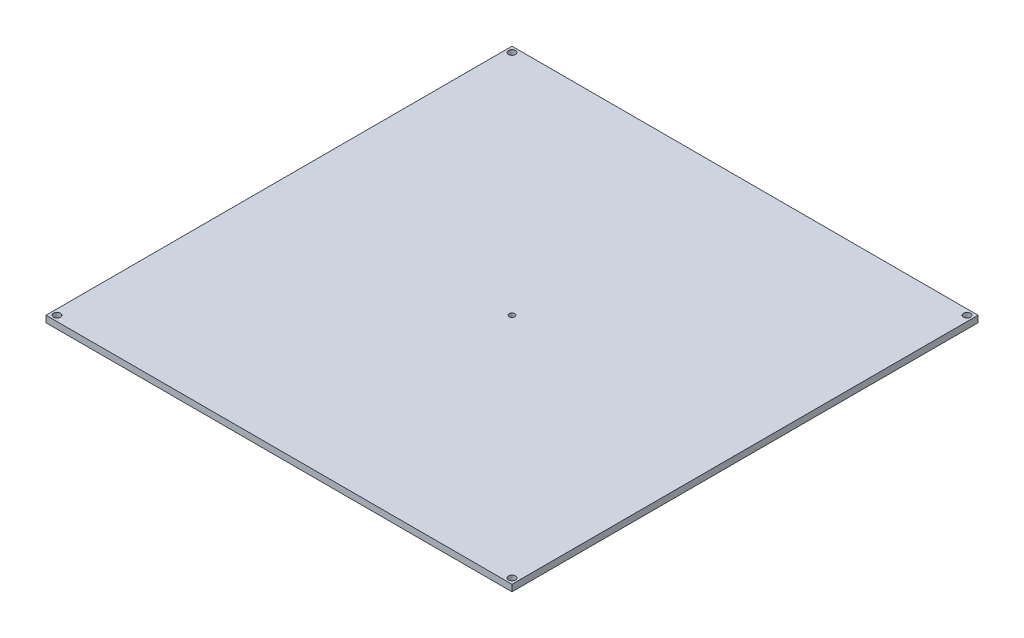
ISO-10303-21;
HEADER;
FILE_DESCRIPTION(('STEP AP214'),'2;1');
FILE_NAME('part.step','',(''),(''),'','','');
FILE_SCHEMA(('AUTOMOTIVE_DESIGN { 1 0 10303 214 1 1 1 1 }'));
ENDSEC;
DATA;
#1=APPLICATION_CONTEXT('core data for automotive mechanical design processes');
#2=APPLICATION_PROTOCOL_DEFINITION('international standard','automotive_design',2000,#1);
#3=PRODUCT_CONTEXT('',#1,'mechanical');
#4=PRODUCT('Part','Part','',(#3));
#5=PRODUCT_RELATED_PRODUCT_CATEGORY('part','',(#4));
#6=PRODUCT_DEFINITION_FORMATION('','',#4);
#7=PRODUCT_DEFINITION_CONTEXT('part definition',#1,'design');
#8=PRODUCT_DEFINITION('design','',#6,#7);
#9=PRODUCT_DEFINITION_SHAPE('','',#8);
#10=(LENGTH_UNIT() NAMED_UNIT(*) SI_UNIT(.MILLI.,.METRE.));
#11=(NAMED_UNIT(*) PLANE_ANGLE_UNIT() SI_UNIT($,.RADIAN.));
#12=(NAMED_UNIT(*) SI_UNIT($,.STERADIAN.) SOLID_ANGLE_UNIT());
#13=UNCERTAINTY_MEASURE_WITH_UNIT(LENGTH_MEASURE(1.E-05),#10,'distance_accuracy_value','');
#14=(GEOMETRIC_REPRESENTATION_CONTEXT(3) GLOBAL_UNCERTAINTY_ASSIGNED_CONTEXT((#13)) GLOBAL_UNIT_ASSIGNED_CONTEXT((#10,
#11,#12)) REPRESENTATION_CONTEXT('',''));
#15=CARTESIAN_POINT('',(0.,0.,0.));
#16=DIRECTION('',(0.,0.,1.));
#17=DIRECTION('',(1.,0.,0.));
#18=AXIS2_PLACEMENT_3D('',#15,#16,#17);
#19=CARTESIAN_POINT('',(106.75,-3.,106.75));
#20=DIRECTION('',(1.,0.,0.));
#21=DIRECTION('',(0.,0.,-1.));
#22=AXIS2_PLACEMENT_3D('',#19,#20,#21);
#23=PLANE('',#22);
#24=DIRECTION('',(0.,0.,-1.));
#25=VECTOR('',#24,1.);
#26=CARTESIAN_POINT('',(106.75,0.,106.75));
#27=LINE('',#26,#25);
#28=CARTESIAN_POINT('',(106.75,0.,106.75));
#29=VERTEX_POINT('',#28);
#30=CARTESIAN_POINT('',(106.75,0.,-106.75));
#31=VERTEX_POINT('',#30);
#32=EDGE_CURVE('E103',#29,#31,#27,.T.);
#33=ORIENTED_EDGE('',*,*,#32,.F.);
#34=DIRECTION('',(0.,1.,0.));
#35=VECTOR('',#34,1.);
#36=CARTESIAN_POINT('',(106.75,-3.,106.75));
#37=LINE('',#36,#35);
#38=CARTESIAN_POINT('',(106.75,-3.,106.75));
#39=VERTEX_POINT('',#38);
#40=EDGE_CURVE('E11',#39,#29,#37,.T.);
#41=ORIENTED_EDGE('',*,*,#40,.F.);
#42=DIRECTION('',(0.,0.,-1.));
#43=VECTOR('',#42,1.);
#44=CARTESIAN_POINT('',(106.75,-3.,106.75));
#45=LINE('',#44,#43);
#46=CARTESIAN_POINT('',(106.75,-3.,-106.75));
#47=VERTEX_POINT('',#46);
#48=EDGE_CURVE('E96',#39,#47,#45,.T.);
#49=ORIENTED_EDGE('',*,*,#48,.T.);
#50=DIRECTION('',(0.,1.,0.));
#51=VECTOR('',#50,1.);
#52=CARTESIAN_POINT('',(106.75,-3.,-106.75));
#53=LINE('',#52,#51);
#54=EDGE_CURVE('E41',#47,#31,#53,.T.);
#55=ORIENTED_EDGE('',*,*,#54,.T.);
#56=EDGE_LOOP('',(#33,#41,#49,#55));
#57=FACE_BOUND('',#56,.T.);
#58=ADVANCED_FACE('F38',(#57),#23,.T.);
#59=CARTESIAN_POINT('',(-106.75,-3.,106.75));
#60=DIRECTION('',(0.,0.,1.));
#61=DIRECTION('',(1.,0.,0.));
#62=AXIS2_PLACEMENT_3D('',#59,#60,#61);
#63=PLANE('',#62);
#64=DIRECTION('',(1.,0.,0.));
#65=VECTOR('',#64,1.);
#66=CARTESIAN_POINT('',(-106.75,0.,106.75));
#67=LINE('',#66,#65);
#68=CARTESIAN_POINT('',(-106.75,0.,106.75));
#69=VERTEX_POINT('',#68);
#70=EDGE_CURVE('E98',#69,#29,#67,.T.);
#71=ORIENTED_EDGE('',*,*,#70,.F.);
#72=DIRECTION('',(0.,1.,0.));
#73=VECTOR('',#72,1.);
#74=CARTESIAN_POINT('',(-106.75,-3.,106.75));
#75=LINE('',#74,#73);
#76=CARTESIAN_POINT('',(-106.75,-3.,106.75));
#77=VERTEX_POINT('',#76);
#78=EDGE_CURVE('E47',#77,#69,#75,.T.);
#79=ORIENTED_EDGE('',*,*,#78,.F.);
#80=DIRECTION('',(1.,0.,0.));
#81=VECTOR('',#80,1.);
#82=CARTESIAN_POINT('',(-106.75,-3.,106.75));
#83=LINE('',#82,#81);
#84=EDGE_CURVE('E93',#77,#39,#83,.T.);
#85=ORIENTED_EDGE('',*,*,#84,.T.);
#86=ORIENTED_EDGE('',*,*,#40,.T.);
#87=EDGE_LOOP('',(#71,#79,#85,#86));
#88=FACE_BOUND('',#87,.T.);
#89=ADVANCED_FACE('F114',(#88),#63,.T.);
#90=CARTESIAN_POINT('',(-106.75,-3.,106.75));
#91=DIRECTION('',(-1.,0.,0.));
#92=DIRECTION('',(0.,0.,1.));
#93=AXIS2_PLACEMENT_3D('',#90,#91,#92);
#94=PLANE('',#93);
#95=DIRECTION('',(0.,0.,1.));
#96=VECTOR('',#95,1.);
#97=CARTESIAN_POINT('',(-106.75,0.,106.75));
#98=LINE('',#97,#96);
#99=CARTESIAN_POINT('',(-106.75,0.,-106.75));
#100=VERTEX_POINT('',#99);
#101=EDGE_CURVE('E88',#100,#69,#98,.T.);
#102=ORIENTED_EDGE('',*,*,#101,.F.);
#103=DIRECTION('',(0.,1.,0.));
#104=VECTOR('',#103,1.);
#105=CARTESIAN_POINT('',(-106.75,-3.,-106.75));
#106=LINE('',#105,#104);
#107=CARTESIAN_POINT('',(-106.75,-3.,-106.75));
#108=VERTEX_POINT('',#107);
#109=EDGE_CURVE('E83',#108,#100,#106,.T.);
#110=ORIENTED_EDGE('',*,*,#109,.F.);
#111=DIRECTION('',(0.,0.,1.));
#112=VECTOR('',#111,1.);
#113=CARTESIAN_POINT('',(-106.75,-3.,106.75));
#114=LINE('',#113,#112);
#115=EDGE_CURVE('E86',#108,#77,#114,.T.);
#116=ORIENTED_EDGE('',*,*,#115,.T.);
#117=ORIENTED_EDGE('',*,*,#78,.T.);
#118=EDGE_LOOP('',(#102,#110,#116,#117));
#119=FACE_BOUND('',#118,.T.);
#120=ADVANCED_FACE('F85',(#119),#94,.T.);
#121=CARTESIAN_POINT('',(-106.75,-3.,-106.75));
#122=DIRECTION('',(0.,0.,-1.));
#123=DIRECTION('',(-1.,0.,0.));
#124=AXIS2_PLACEMENT_3D('',#121,#122,#123);
#125=PLANE('',#124);
#126=DIRECTION('',(-1.,0.,0.));
#127=VECTOR('',#126,1.);
#128=CARTESIAN_POINT('',(-106.75,0.,-106.75));
#129=LINE('',#128,#127);
#130=EDGE_CURVE('E106',#31,#100,#129,.T.);
#131=ORIENTED_EDGE('',*,*,#130,.F.);
#132=ORIENTED_EDGE('',*,*,#54,.F.);
#133=DIRECTION('',(-1.,0.,0.));
#134=VECTOR('',#133,1.);
#135=CARTESIAN_POINT('',(-106.75,-3.,-106.75));
#136=LINE('',#135,#134);
#137=EDGE_CURVE('E92',#47,#108,#136,.T.);
#138=ORIENTED_EDGE('',*,*,#137,.T.);
#139=ORIENTED_EDGE('',*,*,#109,.T.);
#140=EDGE_LOOP('',(#131,#132,#138,#139));
#141=FACE_BOUND('',#140,.T.);
#142=ADVANCED_FACE('F95',(#141),#125,.T.);
#143=CARTESIAN_POINT('',(0.,-3.,0.));
#144=DIRECTION('',(0.,-1.,0.));
#145=DIRECTION('',(0.,0.,-1.));
#146=AXIS2_PLACEMENT_3D('',#143,#144,#145);
#147=PLANE('',#146);
#148=CARTESIAN_POINT('',(0.,-3.,0.));
#149=DIRECTION('',(0.,1.,0.));
#150=DIRECTION('',(0.,0.,1.));
#151=AXIS2_PLACEMENT_3D('',#148,#149,#150);
#152=CIRCLE('',#151,1.25);
#153=CARTESIAN_POINT('',(0.,-3.,1.25));
#154=VERTEX_POINT('',#153);
#155=EDGE_CURVE('E159',#154,#154,#152,.T.);
#156=ORIENTED_EDGE('',*,*,#155,.T.);
#157=EDGE_LOOP('',(#156));
#158=FACE_BOUND('',#157,.T.);
#159=CARTESIAN_POINT('',(104.25,-3.,-104.25));
#160=DIRECTION('',(0.,1.,0.));
#161=DIRECTION('',(0.,0.,1.));
#162=AXIS2_PLACEMENT_3D('',#159,#160,#161);
#163=CIRCLE('',#162,1.6);
#164=CARTESIAN_POINT('',(104.25,-3.,-102.65));
#165=VERTEX_POINT('',#164);
#166=EDGE_CURVE('E169',#165,#165,#163,.T.);
#167=ORIENTED_EDGE('',*,*,#166,.T.);
#168=EDGE_LOOP('',(#167));
#169=FACE_BOUND('',#168,.T.);
#170=CARTESIAN_POINT('',(104.25,-3.,104.25));
#171=DIRECTION('',(0.,1.,0.));
#172=DIRECTION('',(0.,0.,1.));
#173=AXIS2_PLACEMENT_3D('',#170,#171,#172);
#174=CIRCLE('',#173,1.6);
#175=CARTESIAN_POINT('',(104.25,-3.,105.85));
#176=VERTEX_POINT('',#175);
#177=EDGE_CURVE('E175',#176,#176,#174,.T.);
#178=ORIENTED_EDGE('',*,*,#177,.T.);
#179=EDGE_LOOP('',(#178));
#180=FACE_BOUND('',#179,.T.);
#181=CARTESIAN_POINT('',(-104.25,-3.,-104.25));
#182=DIRECTION('',(0.,1.,0.));
#183=DIRECTION('',(0.,0.,1.));
#184=AXIS2_PLACEMENT_3D('',#181,#182,#183);
#185=CIRCLE('',#184,1.6);
#186=CARTESIAN_POINT('',(-104.25,-3.,-102.65));
#187=VERTEX_POINT('',#186);
#188=EDGE_CURVE('E181',#187,#187,#185,.T.);
#189=ORIENTED_EDGE('',*,*,#188,.T.);
#190=EDGE_LOOP('',(#189));
#191=FACE_BOUND('',#190,.T.);
#192=CARTESIAN_POINT('',(-104.25,-3.,104.25));
#193=DIRECTION('',(0.,1.,0.));
#194=DIRECTION('',(0.,0.,1.));
#195=AXIS2_PLACEMENT_3D('',#192,#193,#194);
#196=CIRCLE('',#195,1.6);
#197=CARTESIAN_POINT('',(-104.25,-3.,105.85));
#198=VERTEX_POINT('',#197);
#199=EDGE_CURVE('E107',#198,#198,#196,.T.);
#200=ORIENTED_EDGE('',*,*,#199,.T.);
#201=EDGE_LOOP('',(#200));
#202=FACE_BOUND('',#201,.T.);
#203=ORIENTED_EDGE('',*,*,#48,.F.);
#204=ORIENTED_EDGE('',*,*,#84,.F.);
#205=ORIENTED_EDGE('',*,*,#115,.F.);
#206=ORIENTED_EDGE('',*,*,#137,.F.);
#207=EDGE_LOOP('',(#203,#204,#205,#206));
#208=FACE_BOUND('',#207,.T.);
#209=ADVANCED_FACE('F91',(#158,#169,#180,#191,#202,#208),#147,.T.);
#210=CARTESIAN_POINT('',(0.,0.,0.));
#211=DIRECTION('',(0.,-1.,0.));
#212=DIRECTION('',(0.,0.,-1.));
#213=AXIS2_PLACEMENT_3D('',#210,#211,#212);
#214=PLANE('',#213);
#215=CARTESIAN_POINT('',(0.,0.,0.));
#216=DIRECTION('',(0.,1.,0.));
#217=DIRECTION('',(0.,0.,1.));
#218=AXIS2_PLACEMENT_3D('',#215,#216,#217);
#219=CIRCLE('',#218,1.25);
#220=CARTESIAN_POINT('',(0.,0.,1.25));
#221=VERTEX_POINT('',#220);
#222=EDGE_CURVE('E162',#221,#221,#219,.T.);
#223=ORIENTED_EDGE('',*,*,#222,.F.);
#224=EDGE_LOOP('',(#223));
#225=FACE_BOUND('',#224,.T.);
#226=CARTESIAN_POINT('',(104.25,0.,-104.25));
#227=DIRECTION('',(0.,1.,0.));
#228=DIRECTION('',(0.,0.,1.));
#229=AXIS2_PLACEMENT_3D('',#226,#227,#228);
#230=CIRCLE('',#229,1.6);
#231=CARTESIAN_POINT('',(104.25,0.,-102.65));
#232=VERTEX_POINT('',#231);
#233=EDGE_CURVE('E164',#232,#232,#230,.T.);
#234=ORIENTED_EDGE('',*,*,#233,.F.);
#235=EDGE_LOOP('',(#234));
#236=FACE_BOUND('',#235,.T.);
#237=CARTESIAN_POINT('',(104.25,0.,104.25));
#238=DIRECTION('',(0.,1.,0.));
#239=DIRECTION('',(0.,0.,1.));
#240=AXIS2_PLACEMENT_3D('',#237,#238,#239);
#241=CIRCLE('',#240,1.6);
#242=CARTESIAN_POINT('',(104.25,0.,105.85));
#243=VERTEX_POINT('',#242);
#244=EDGE_CURVE('E172',#243,#243,#241,.T.);
#245=ORIENTED_EDGE('',*,*,#244,.F.);
#246=EDGE_LOOP('',(#245));
#247=FACE_BOUND('',#246,.T.);
#248=CARTESIAN_POINT('',(-104.25,0.,-104.25));
#249=DIRECTION('',(0.,1.,0.));
#250=DIRECTION('',(0.,0.,1.));
#251=AXIS2_PLACEMENT_3D('',#248,#249,#250);
#252=CIRCLE('',#251,1.6);
#253=CARTESIAN_POINT('',(-104.25,0.,-102.65));
#254=VERTEX_POINT('',#253);
#255=EDGE_CURVE('E178',#254,#254,#252,.T.);
#256=ORIENTED_EDGE('',*,*,#255,.F.);
#257=EDGE_LOOP('',(#256));
#258=FACE_BOUND('',#257,.T.);
#259=CARTESIAN_POINT('',(-104.25,0.,104.25));
#260=DIRECTION('',(0.,1.,0.));
#261=DIRECTION('',(0.,0.,1.));
#262=AXIS2_PLACEMENT_3D('',#259,#260,#261);
#263=CIRCLE('',#262,1.6);
#264=CARTESIAN_POINT('',(-104.25,0.,105.85));
#265=VERTEX_POINT('',#264);
#266=EDGE_CURVE('E184',#265,#265,#263,.T.);
#267=ORIENTED_EDGE('',*,*,#266,.F.);
#268=EDGE_LOOP('',(#267));
#269=FACE_BOUND('',#268,.T.);
#270=ORIENTED_EDGE('',*,*,#32,.T.);
#271=ORIENTED_EDGE('',*,*,#130,.T.);
#272=ORIENTED_EDGE('',*,*,#101,.T.);
#273=ORIENTED_EDGE('',*,*,#70,.T.);
#274=EDGE_LOOP('',(#270,#271,#272,#273));
#275=FACE_BOUND('',#274,.T.);
#276=ADVANCED_FACE('F113',(#225,#236,#247,#258,#269,#275),#214,.F.);
#277=CARTESIAN_POINT('',(-104.25,0.,104.25));
#278=DIRECTION('',(0.,1.,0.));
#279=DIRECTION('',(0.,0.,1.));
#280=AXIS2_PLACEMENT_3D('',#277,#278,#279);
#281=CYLINDRICAL_SURFACE('',#280,1.6);
#282=ORIENTED_EDGE('',*,*,#199,.F.);
#283=EDGE_LOOP('',(#282));
#284=FACE_BOUND('',#283,.T.);
#285=ORIENTED_EDGE('',*,*,#266,.T.);
#286=EDGE_LOOP('',(#285));
#287=FACE_BOUND('',#286,.T.);
#288=ADVANCED_FACE('F132',(#284,#287),#281,.F.);
#289=CARTESIAN_POINT('',(-104.25,0.,-104.25));
#290=DIRECTION('',(0.,1.,0.));
#291=DIRECTION('',(0.,0.,1.));
#292=AXIS2_PLACEMENT_3D('',#289,#290,#291);
#293=CYLINDRICAL_SURFACE('',#292,1.6);
#294=ORIENTED_EDGE('',*,*,#188,.F.);
#295=EDGE_LOOP('',(#294));
#296=FACE_BOUND('',#295,.T.);
#297=ORIENTED_EDGE('',*,*,#255,.T.);
#298=EDGE_LOOP('',(#297));
#299=FACE_BOUND('',#298,.T.);
#300=ADVANCED_FACE('F139',(#296,#299),#293,.F.);
#301=CARTESIAN_POINT('',(104.25,0.,104.25));
#302=DIRECTION('',(0.,1.,0.));
#303=DIRECTION('',(0.,0.,1.));
#304=AXIS2_PLACEMENT_3D('',#301,#302,#303);
#305=CYLINDRICAL_SURFACE('',#304,1.6);
#306=ORIENTED_EDGE('',*,*,#177,.F.);
#307=EDGE_LOOP('',(#306));
#308=FACE_BOUND('',#307,.T.);
#309=ORIENTED_EDGE('',*,*,#244,.T.);
#310=EDGE_LOOP('',(#309));
#311=FACE_BOUND('',#310,.T.);
#312=ADVANCED_FACE('F143',(#308,#311),#305,.F.);
#313=CARTESIAN_POINT('',(104.25,0.,-104.25));
#314=DIRECTION('',(0.,1.,0.));
#315=DIRECTION('',(0.,0.,1.));
#316=AXIS2_PLACEMENT_3D('',#313,#314,#315);
#317=CYLINDRICAL_SURFACE('',#316,1.6);
#318=ORIENTED_EDGE('',*,*,#166,.F.);
#319=EDGE_LOOP('',(#318));
#320=FACE_BOUND('',#319,.T.);
#321=ORIENTED_EDGE('',*,*,#233,.T.);
#322=EDGE_LOOP('',(#321));
#323=FACE_BOUND('',#322,.T.);
#324=ADVANCED_FACE('F147',(#320,#323),#317,.F.);
#325=CARTESIAN_POINT('',(0.,0.,0.));
#326=DIRECTION('',(0.,1.,0.));
#327=DIRECTION('',(0.,0.,1.));
#328=AXIS2_PLACEMENT_3D('',#325,#326,#327);
#329=CYLINDRICAL_SURFACE('',#328,1.25);
#330=ORIENTED_EDGE('',*,*,#155,.F.);
#331=EDGE_LOOP('',(#330));
#332=FACE_BOUND('',#331,.T.);
#333=ORIENTED_EDGE('',*,*,#222,.T.);
#334=EDGE_LOOP('',(#333));
#335=FACE_BOUND('',#334,.T.);
#336=ADVANCED_FACE('F151',(#332,#335),#329,.F.);
#337=CLOSED_SHELL('',(#58,#89,#120,#142,#209,#276,#288,#300,#312,#324,#336));
#338=MANIFOLD_SOLID_BREP('B2',#337);
#339=ADVANCED_BREP_SHAPE_REPRESENTATION('',(#18,#338),#14);
#340=SHAPE_DEFINITION_REPRESENTATION(#9,#339);
ENDSEC;
END-ISO-10303-21;
